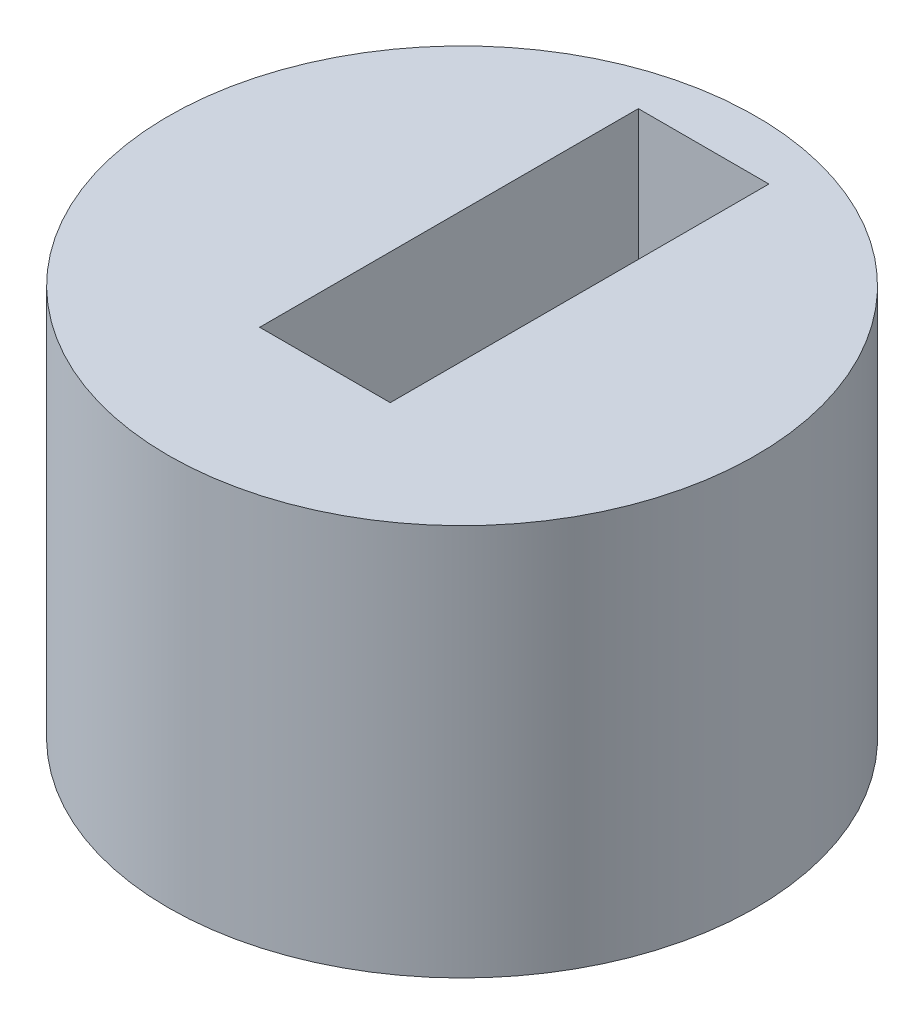
ISO-10303-21;
HEADER;
FILE_DESCRIPTION(('STEP AP214'),'2;1');
FILE_NAME('part.step','',(''),(''),'','','');
FILE_SCHEMA(('AUTOMOTIVE_DESIGN { 1 0 10303 214 1 1 1 1 }'));
ENDSEC;
DATA;
#1=APPLICATION_CONTEXT('core data for automotive mechanical design processes');
#2=APPLICATION_PROTOCOL_DEFINITION('international standard','automotive_design',2000,#1);
#3=PRODUCT_CONTEXT('',#1,'mechanical');
#4=PRODUCT('Part','Part','',(#3));
#5=PRODUCT_RELATED_PRODUCT_CATEGORY('part','',(#4));
#6=PRODUCT_DEFINITION_FORMATION('','',#4);
#7=PRODUCT_DEFINITION_CONTEXT('part definition',#1,'design');
#8=PRODUCT_DEFINITION('design','',#6,#7);
#9=PRODUCT_DEFINITION_SHAPE('','',#8);
#10=(LENGTH_UNIT() NAMED_UNIT(*) SI_UNIT(.MILLI.,.METRE.));
#11=(NAMED_UNIT(*) PLANE_ANGLE_UNIT() SI_UNIT($,.RADIAN.));
#12=(NAMED_UNIT(*) SI_UNIT($,.STERADIAN.) SOLID_ANGLE_UNIT());
#13=UNCERTAINTY_MEASURE_WITH_UNIT(LENGTH_MEASURE(1.E-05),#10,'distance_accuracy_value','');
#14=(GEOMETRIC_REPRESENTATION_CONTEXT(3) GLOBAL_UNCERTAINTY_ASSIGNED_CONTEXT((#13)) GLOBAL_UNIT_ASSIGNED_CONTEXT((#10,
#11,#12)) REPRESENTATION_CONTEXT('',''));
#15=CARTESIAN_POINT('',(0.,0.,0.));
#16=DIRECTION('',(0.,0.,1.));
#17=DIRECTION('',(1.,0.,0.));
#18=AXIS2_PLACEMENT_3D('',#15,#16,#17);
#19=CARTESIAN_POINT('',(0.,60.,0.));
#20=DIRECTION('',(0.,-1.,0.));
#21=DIRECTION('',(0.,0.,-1.));
#22=AXIS2_PLACEMENT_3D('',#19,#20,#21);
#23=CYLINDRICAL_SURFACE('',#22,45.);
#24=CARTESIAN_POINT('',(0.,60.,0.));
#25=DIRECTION('',(0.,1.,0.));
#26=DIRECTION('',(0.,0.,1.));
#27=AXIS2_PLACEMENT_3D('',#24,#25,#26);
#28=CIRCLE('',#27,45.);
#29=CARTESIAN_POINT('',(0.,60.,45.));
#30=VERTEX_POINT('',#29);
#31=EDGE_CURVE('E11',#30,#30,#28,.T.);
#32=ORIENTED_EDGE('',*,*,#31,.F.);
#33=EDGE_LOOP('',(#32));
#34=FACE_BOUND('',#33,.T.);
#35=CARTESIAN_POINT('',(0.,0.,0.));
#36=DIRECTION('',(0.,1.,0.));
#37=DIRECTION('',(0.,0.,1.));
#38=AXIS2_PLACEMENT_3D('',#35,#36,#37);
#39=CIRCLE('',#38,45.);
#40=CARTESIAN_POINT('',(0.,0.,45.));
#41=VERTEX_POINT('',#40);
#42=EDGE_CURVE('E40',#41,#41,#39,.T.);
#43=ORIENTED_EDGE('',*,*,#42,.T.);
#44=EDGE_LOOP('',(#43));
#45=FACE_BOUND('',#44,.T.);
#46=ADVANCED_FACE('F37',(#34,#45),#23,.T.);
#47=CARTESIAN_POINT('',(0.,60.,0.));
#48=DIRECTION('',(0.,1.,0.));
#49=DIRECTION('',(0.,0.,1.));
#50=AXIS2_PLACEMENT_3D('',#47,#48,#49);
#51=PLANE('',#50);
#52=DIRECTION('',(0.,0.,1.));
#53=VECTOR('',#52,1.);
#54=CARTESIAN_POINT('',(-10.,60.,21.));
#55=LINE('',#54,#53);
#56=CARTESIAN_POINT('',(-10.,60.,-37.));
#57=VERTEX_POINT('',#56);
#58=CARTESIAN_POINT('',(-10.,60.,21.));
#59=VERTEX_POINT('',#58);
#60=EDGE_CURVE('E51',#57,#59,#55,.T.);
#61=ORIENTED_EDGE('',*,*,#60,.F.);
#62=DIRECTION('',(-1.,0.,0.));
#63=VECTOR('',#62,1.);
#64=CARTESIAN_POINT('',(10.,60.,-37.));
#65=LINE('',#64,#63);
#66=CARTESIAN_POINT('',(10.,60.,-37.));
#67=VERTEX_POINT('',#66);
#68=EDGE_CURVE('E102',#67,#57,#65,.T.);
#69=ORIENTED_EDGE('',*,*,#68,.F.);
#70=DIRECTION('',(0.,0.,-1.));
#71=VECTOR('',#70,1.);
#72=CARTESIAN_POINT('',(10.,60.,21.));
#73=LINE('',#72,#71);
#74=CARTESIAN_POINT('',(10.,60.,21.));
#75=VERTEX_POINT('',#74);
#76=EDGE_CURVE('E108',#75,#67,#73,.T.);
#77=ORIENTED_EDGE('',*,*,#76,.F.);
#78=DIRECTION('',(1.,0.,0.));
#79=VECTOR('',#78,1.);
#80=CARTESIAN_POINT('',(10.,60.,21.));
#81=LINE('',#80,#79);
#82=EDGE_CURVE('E86',#59,#75,#81,.T.);
#83=ORIENTED_EDGE('',*,*,#82,.F.);
#84=EDGE_LOOP('',(#61,#69,#77,#83));
#85=FACE_BOUND('',#84,.T.);
#86=ORIENTED_EDGE('',*,*,#31,.T.);
#87=EDGE_LOOP('',(#86));
#88=FACE_BOUND('',#87,.T.);
#89=ADVANCED_FACE('F114',(#85,#88),#51,.T.);
#90=CARTESIAN_POINT('',(0.,0.,0.));
#91=DIRECTION('',(0.,1.,0.));
#92=DIRECTION('',(0.,0.,1.));
#93=AXIS2_PLACEMENT_3D('',#90,#91,#92);
#94=PLANE('',#93);
#95=ORIENTED_EDGE('',*,*,#42,.F.);
#96=EDGE_LOOP('',(#95));
#97=FACE_BOUND('',#96,.T.);
#98=ADVANCED_FACE('F126',(#97),#94,.F.);
#99=CARTESIAN_POINT('',(-10.,20.,21.));
#100=DIRECTION('',(-1.,0.,0.));
#101=DIRECTION('',(0.,0.,1.));
#102=AXIS2_PLACEMENT_3D('',#99,#100,#101);
#103=PLANE('',#102);
#104=ORIENTED_EDGE('',*,*,#60,.T.);
#105=DIRECTION('',(0.,1.,0.));
#106=VECTOR('',#105,1.);
#107=CARTESIAN_POINT('',(-10.,20.,21.));
#108=LINE('',#107,#106);
#109=CARTESIAN_POINT('',(-10.,20.,21.));
#110=VERTEX_POINT('',#109);
#111=EDGE_CURVE('E74',#110,#59,#108,.T.);
#112=ORIENTED_EDGE('',*,*,#111,.F.);
#113=DIRECTION('',(0.,0.,1.));
#114=VECTOR('',#113,1.);
#115=CARTESIAN_POINT('',(-10.,20.,21.));
#116=LINE('',#115,#114);
#117=CARTESIAN_POINT('',(-10.,20.,-37.));
#118=VERTEX_POINT('',#117);
#119=EDGE_CURVE('E100',#118,#110,#116,.T.);
#120=ORIENTED_EDGE('',*,*,#119,.F.);
#121=DIRECTION('',(0.,1.,0.));
#122=VECTOR('',#121,1.);
#123=CARTESIAN_POINT('',(-10.,20.,-37.));
#124=LINE('',#123,#122);
#125=EDGE_CURVE('E59',#118,#57,#124,.T.);
#126=ORIENTED_EDGE('',*,*,#125,.T.);
#127=EDGE_LOOP('',(#104,#112,#120,#126));
#128=FACE_BOUND('',#127,.T.);
#129=ADVANCED_FACE('F119',(#128),#103,.F.);
#130=CARTESIAN_POINT('',(10.,20.,-37.));
#131=DIRECTION('',(0.,0.,-1.));
#132=DIRECTION('',(-1.,0.,0.));
#133=AXIS2_PLACEMENT_3D('',#130,#131,#132);
#134=PLANE('',#133);
#135=ORIENTED_EDGE('',*,*,#68,.T.);
#136=ORIENTED_EDGE('',*,*,#125,.F.);
#137=DIRECTION('',(-1.,0.,0.));
#138=VECTOR('',#137,1.);
#139=CARTESIAN_POINT('',(10.,20.,-37.));
#140=LINE('',#139,#138);
#141=CARTESIAN_POINT('',(10.,20.,-37.));
#142=VERTEX_POINT('',#141);
#143=EDGE_CURVE('E97',#142,#118,#140,.T.);
#144=ORIENTED_EDGE('',*,*,#143,.F.);
#145=DIRECTION('',(0.,1.,0.));
#146=VECTOR('',#145,1.);
#147=CARTESIAN_POINT('',(10.,20.,-37.));
#148=LINE('',#147,#146);
#149=EDGE_CURVE('E90',#142,#67,#148,.T.);
#150=ORIENTED_EDGE('',*,*,#149,.T.);
#151=EDGE_LOOP('',(#135,#136,#144,#150));
#152=FACE_BOUND('',#151,.T.);
#153=ADVANCED_FACE('F117',(#152),#134,.F.);
#154=CARTESIAN_POINT('',(10.,20.,21.));
#155=DIRECTION('',(1.,0.,0.));
#156=DIRECTION('',(0.,0.,-1.));
#157=AXIS2_PLACEMENT_3D('',#154,#155,#156);
#158=PLANE('',#157);
#159=ORIENTED_EDGE('',*,*,#76,.T.);
#160=ORIENTED_EDGE('',*,*,#149,.F.);
#161=DIRECTION('',(0.,0.,-1.));
#162=VECTOR('',#161,1.);
#163=CARTESIAN_POINT('',(10.,20.,21.));
#164=LINE('',#163,#162);
#165=CARTESIAN_POINT('',(10.,20.,21.));
#166=VERTEX_POINT('',#165);
#167=EDGE_CURVE('E93',#166,#142,#164,.T.);
#168=ORIENTED_EDGE('',*,*,#167,.F.);
#169=DIRECTION('',(0.,1.,0.));
#170=VECTOR('',#169,1.);
#171=CARTESIAN_POINT('',(10.,20.,21.));
#172=LINE('',#171,#170);
#173=EDGE_CURVE('E79',#166,#75,#172,.T.);
#174=ORIENTED_EDGE('',*,*,#173,.T.);
#175=EDGE_LOOP('',(#159,#160,#168,#174));
#176=FACE_BOUND('',#175,.T.);
#177=ADVANCED_FACE('F94',(#176),#158,.F.);
#178=CARTESIAN_POINT('',(10.,20.,21.));
#179=DIRECTION('',(0.,0.,1.));
#180=DIRECTION('',(1.,0.,0.));
#181=AXIS2_PLACEMENT_3D('',#178,#179,#180);
#182=PLANE('',#181);
#183=ORIENTED_EDGE('',*,*,#82,.T.);
#184=ORIENTED_EDGE('',*,*,#173,.F.);
#185=DIRECTION('',(1.,0.,0.));
#186=VECTOR('',#185,1.);
#187=CARTESIAN_POINT('',(10.,20.,21.));
#188=LINE('',#187,#186);
#189=EDGE_CURVE('E83',#110,#166,#188,.T.);
#190=ORIENTED_EDGE('',*,*,#189,.F.);
#191=ORIENTED_EDGE('',*,*,#111,.T.);
#192=EDGE_LOOP('',(#183,#184,#190,#191));
#193=FACE_BOUND('',#192,.T.);
#194=ADVANCED_FACE('F81',(#193),#182,.F.);
#195=CARTESIAN_POINT('',(0.,20.,0.));
#196=DIRECTION('',(0.,1.,0.));
#197=DIRECTION('',(0.,0.,1.));
#198=AXIS2_PLACEMENT_3D('',#195,#196,#197);
#199=PLANE('',#198);
#200=ORIENTED_EDGE('',*,*,#119,.T.);
#201=ORIENTED_EDGE('',*,*,#189,.T.);
#202=ORIENTED_EDGE('',*,*,#167,.T.);
#203=ORIENTED_EDGE('',*,*,#143,.T.);
#204=EDGE_LOOP('',(#200,#201,#202,#203));
#205=FACE_BOUND('',#204,.T.);
#206=ADVANCED_FACE('F99',(#205),#199,.T.);
#207=CLOSED_SHELL('',(#46,#89,#98,#129,#153,#177,#194,#206));
#208=MANIFOLD_SOLID_BREP('B2',#207);
#209=ADVANCED_BREP_SHAPE_REPRESENTATION('',(#18,#208),#14);
#210=SHAPE_DEFINITION_REPRESENTATION(#9,#209);
ENDSEC;
END-ISO-10303-21;
